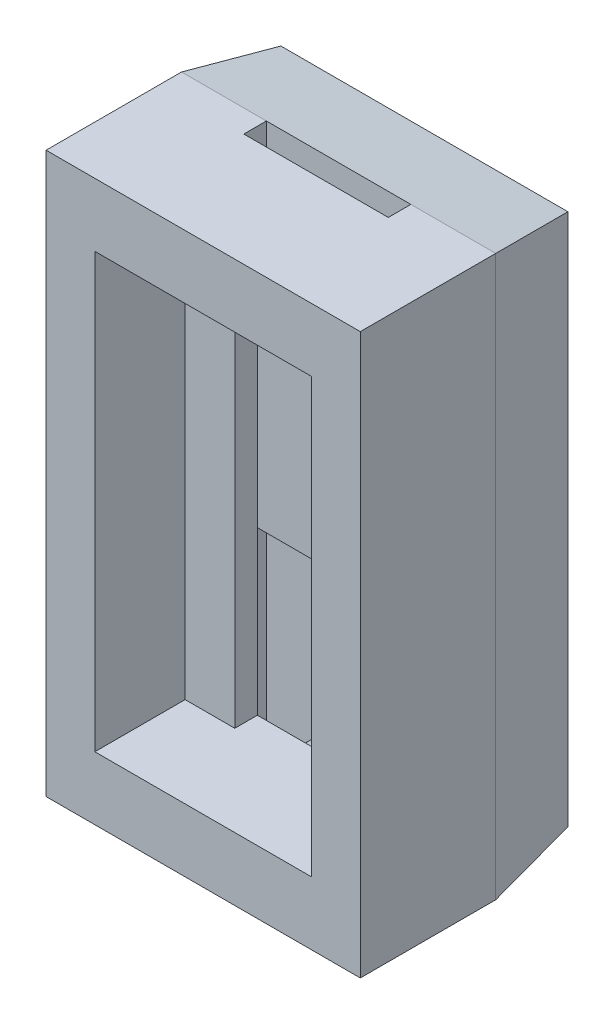
ISO-10303-21;
HEADER;
FILE_DESCRIPTION(('STEP AP214'),'2;1');
FILE_NAME('part.step','',(''),(''),'','','');
FILE_SCHEMA(('AUTOMOTIVE_DESIGN { 1 0 10303 214 1 1 1 1 }'));
ENDSEC;
DATA;
#1=APPLICATION_CONTEXT('core data for automotive mechanical design processes');
#2=APPLICATION_PROTOCOL_DEFINITION('international standard','automotive_design',2000,#1);
#3=PRODUCT_CONTEXT('',#1,'mechanical');
#4=PRODUCT('Part','Part','',(#3));
#5=PRODUCT_RELATED_PRODUCT_CATEGORY('part','',(#4));
#6=PRODUCT_DEFINITION_FORMATION('','',#4);
#7=PRODUCT_DEFINITION_CONTEXT('part definition',#1,'design');
#8=PRODUCT_DEFINITION('design','',#6,#7);
#9=PRODUCT_DEFINITION_SHAPE('','',#8);
#10=(LENGTH_UNIT() NAMED_UNIT(*) SI_UNIT(.MILLI.,.METRE.));
#11=(NAMED_UNIT(*) PLANE_ANGLE_UNIT() SI_UNIT($,.RADIAN.));
#12=(NAMED_UNIT(*) SI_UNIT($,.STERADIAN.) SOLID_ANGLE_UNIT());
#13=UNCERTAINTY_MEASURE_WITH_UNIT(LENGTH_MEASURE(1.E-05),#10,'distance_accuracy_value','');
#14=(GEOMETRIC_REPRESENTATION_CONTEXT(3) GLOBAL_UNCERTAINTY_ASSIGNED_CONTEXT((#13)) GLOBAL_UNIT_ASSIGNED_CONTEXT((#10,
#11,#12)) REPRESENTATION_CONTEXT('',''));
#15=CARTESIAN_POINT('',(0.,0.,0.));
#16=DIRECTION('',(0.,0.,1.));
#17=DIRECTION('',(1.,0.,0.));
#18=AXIS2_PLACEMENT_3D('',#15,#16,#17);
#19=CARTESIAN_POINT('',(0.8,-0.6,0.25));
#20=DIRECTION('',(1.,0.,0.));
#21=DIRECTION('',(0.,0.,-1.));
#22=AXIS2_PLACEMENT_3D('',#19,#20,#21);
#23=PLANE('',#22);
#24=DIRECTION('',(0.,0.,-1.));
#25=VECTOR('',#24,1.);
#26=CARTESIAN_POINT('',(0.8,-3.1,0.25));
#27=LINE('',#26,#25);
#28=CARTESIAN_POINT('',(0.8,-3.1,0.25));
#29=VERTEX_POINT('',#28);
#30=CARTESIAN_POINT('',(0.8,-3.1,0.));
#31=VERTEX_POINT('',#30);
#32=EDGE_CURVE('E230',#29,#31,#27,.T.);
#33=ORIENTED_EDGE('',*,*,#32,.F.);
#34=DIRECTION('',(0.,1.,0.));
#35=VECTOR('',#34,1.);
#36=CARTESIAN_POINT('',(0.8,-2.4,0.25));
#37=LINE('',#36,#35);
#38=CARTESIAN_POINT('',(0.8,-0.6,0.25));
#39=VERTEX_POINT('',#38);
#40=EDGE_CURVE('E341',#39,#29,#37,.F.);
#41=ORIENTED_EDGE('',*,*,#40,.F.);
#42=DIRECTION('',(0.,0.,-1.));
#43=VECTOR('',#42,1.);
#44=CARTESIAN_POINT('',(0.8,-0.6,0.25));
#45=LINE('',#44,#43);
#46=CARTESIAN_POINT('',(0.8,-0.6,0.));
#47=VERTEX_POINT('',#46);
#48=EDGE_CURVE('E239',#47,#39,#45,.F.);
#49=ORIENTED_EDGE('',*,*,#48,.F.);
#50=DIRECTION('',(0.,-1.,0.));
#51=VECTOR('',#50,1.);
#52=CARTESIAN_POINT('',(0.8,-0.6,0.));
#53=LINE('',#52,#51);
#54=EDGE_CURVE('E210',#31,#47,#53,.F.);
#55=ORIENTED_EDGE('',*,*,#54,.F.);
#56=EDGE_LOOP('',(#33,#41,#49,#55));
#57=FACE_BOUND('',#56,.T.);
#58=ADVANCED_FACE('F17',(#57),#23,.F.);
#59=CARTESIAN_POINT('',(-0.8,-3.1,0.25));
#60=DIRECTION('',(-1.,0.,0.));
#61=DIRECTION('',(0.,0.,1.));
#62=AXIS2_PLACEMENT_3D('',#59,#60,#61);
#63=PLANE('',#62);
#64=DIRECTION('',(0.,0.,-1.));
#65=VECTOR('',#64,1.);
#66=CARTESIAN_POINT('',(-0.8,-0.6,0.25));
#67=LINE('',#66,#65);
#68=CARTESIAN_POINT('',(-0.8,-0.6,0.25));
#69=VERTEX_POINT('',#68);
#70=CARTESIAN_POINT('',(-0.8,-0.6,0.));
#71=VERTEX_POINT('',#70);
#72=EDGE_CURVE('E252',#69,#71,#67,.T.);
#73=ORIENTED_EDGE('',*,*,#72,.F.);
#74=DIRECTION('',(0.,1.,0.));
#75=VECTOR('',#74,1.);
#76=CARTESIAN_POINT('',(-0.8,-2.4,0.25));
#77=LINE('',#76,#75);
#78=CARTESIAN_POINT('',(-0.8,-3.1,0.25));
#79=VERTEX_POINT('',#78);
#80=EDGE_CURVE('E343',#79,#69,#77,.T.);
#81=ORIENTED_EDGE('',*,*,#80,.F.);
#82=DIRECTION('',(0.,0.,1.));
#83=VECTOR('',#82,1.);
#84=CARTESIAN_POINT('',(-0.8,-3.1,0.25));
#85=LINE('',#84,#83);
#86=CARTESIAN_POINT('',(-0.8,-3.1,0.));
#87=VERTEX_POINT('',#86);
#88=EDGE_CURVE('E236',#87,#79,#85,.T.);
#89=ORIENTED_EDGE('',*,*,#88,.F.);
#90=DIRECTION('',(0.,-1.,0.));
#91=VECTOR('',#90,1.);
#92=CARTESIAN_POINT('',(-0.8,-0.6,0.));
#93=LINE('',#92,#91);
#94=EDGE_CURVE('E212',#71,#87,#93,.T.);
#95=ORIENTED_EDGE('',*,*,#94,.F.);
#96=EDGE_LOOP('',(#73,#81,#89,#95));
#97=FACE_BOUND('',#96,.T.);
#98=ADVANCED_FACE('F505',(#97),#63,.F.);
#99=CARTESIAN_POINT('',(-0.65,-0.6,0.));
#100=DIRECTION('',(0.,0.,1.));
#101=DIRECTION('',(0.,-1.,0.));
#102=AXIS2_PLACEMENT_3D('',#99,#100,#101);
#103=PLANE('',#102);
#104=ORIENTED_EDGE('',*,*,#54,.T.);
#105=DIRECTION('',(1.,0.,0.));
#106=VECTOR('',#105,1.);
#107=CARTESIAN_POINT('',(-0.65,-0.6,0.));
#108=LINE('',#107,#106);
#109=EDGE_CURVE('E253',#71,#47,#108,.T.);
#110=ORIENTED_EDGE('',*,*,#109,.F.);
#111=ORIENTED_EDGE('',*,*,#94,.T.);
#112=DIRECTION('',(1.,0.,0.));
#113=VECTOR('',#112,1.);
#114=CARTESIAN_POINT('',(-0.65,-3.1,0.));
#115=LINE('',#114,#113);
#116=EDGE_CURVE('E204',#87,#31,#115,.T.);
#117=ORIENTED_EDGE('',*,*,#116,.T.);
#118=EDGE_LOOP('',(#104,#110,#111,#117));
#119=FACE_BOUND('',#118,.T.);
#120=CARTESIAN_POINT('',(0.,-2.6,0.));
#121=DIRECTION('',(0.,0.,1.));
#122=DIRECTION('',(0.,-1.,0.));
#123=AXIS2_PLACEMENT_3D('',#120,#121,#122);
#124=CIRCLE('',#123,0.225);
#125=CARTESIAN_POINT('',(0.,-2.825,0.));
#126=VERTEX_POINT('',#125);
#127=EDGE_CURVE('E269',#126,#126,#124,.T.);
#128=ORIENTED_EDGE('',*,*,#127,.F.);
#129=EDGE_LOOP('',(#128));
#130=FACE_BOUND('',#129,.T.);
#131=ADVANCED_FACE('F206',(#119,#130),#103,.T.);
#132=CARTESIAN_POINT('',(0.65,0.,0.));
#133=DIRECTION('',(1.,0.,0.));
#134=DIRECTION('',(0.,0.,-1.));
#135=AXIS2_PLACEMENT_3D('',#132,#133,#134);
#136=PLANE('',#135);
#137=DIRECTION('',(0.,0.,-1.));
#138=VECTOR('',#137,1.);
#139=CARTESIAN_POINT('',(0.65,-2.4,0.));
#140=LINE('',#139,#138);
#141=CARTESIAN_POINT('',(0.65,-2.4,0.5));
#142=VERTEX_POINT('',#141);
#143=CARTESIAN_POINT('',(0.65,-2.4,0.25));
#144=VERTEX_POINT('',#143);
#145=EDGE_CURVE('E312',#142,#144,#140,.T.);
#146=ORIENTED_EDGE('',*,*,#145,.F.);
#147=DIRECTION('',(0.,1.,0.));
#148=VECTOR('',#147,1.);
#149=CARTESIAN_POINT('',(0.65,0.,0.5));
#150=LINE('',#149,#148);
#151=CARTESIAN_POINT('',(0.65,2.4,0.5));
#152=VERTEX_POINT('',#151);
#153=EDGE_CURVE('E297',#142,#152,#150,.T.);
#154=ORIENTED_EDGE('',*,*,#153,.T.);
#155=DIRECTION('',(0.,0.,-1.));
#156=VECTOR('',#155,1.);
#157=CARTESIAN_POINT('',(0.65,2.4,0.));
#158=LINE('',#157,#156);
#159=CARTESIAN_POINT('',(0.65,2.4,0.25));
#160=VERTEX_POINT('',#159);
#161=EDGE_CURVE('E243',#160,#152,#158,.F.);
#162=ORIENTED_EDGE('',*,*,#161,.F.);
#163=DIRECTION('',(0.,1.,0.));
#164=VECTOR('',#163,1.);
#165=CARTESIAN_POINT('',(0.65,0.,0.25));
#166=LINE('',#165,#164);
#167=CARTESIAN_POINT('',(0.65,1.4,0.25));
#168=VERTEX_POINT('',#167);
#169=EDGE_CURVE('E240',#168,#160,#166,.T.);
#170=ORIENTED_EDGE('',*,*,#169,.F.);
#171=DIRECTION('',(0.,1.,0.));
#172=VECTOR('',#171,1.);
#173=CARTESIAN_POINT('',(0.65,1.4,0.25));
#174=LINE('',#173,#172);
#175=CARTESIAN_POINT('',(0.65,-0.6,0.25));
#176=VERTEX_POINT('',#175);
#177=EDGE_CURVE('E268',#176,#168,#174,.T.);
#178=ORIENTED_EDGE('',*,*,#177,.F.);
#179=DIRECTION('',(0.,1.,0.));
#180=VECTOR('',#179,1.);
#181=CARTESIAN_POINT('',(0.65,-2.4,0.25));
#182=LINE('',#181,#180);
#183=EDGE_CURVE('E492',#144,#176,#182,.T.);
#184=ORIENTED_EDGE('',*,*,#183,.F.);
#185=EDGE_LOOP('',(#146,#154,#162,#170,#178,#184));
#186=FACE_BOUND('',#185,.T.);
#187=ADVANCED_FACE('F435',(#186),#136,.F.);
#188=CARTESIAN_POINT('',(-0.65,0.,0.));
#189=DIRECTION('',(1.,0.,0.));
#190=DIRECTION('',(0.,0.,-1.));
#191=AXIS2_PLACEMENT_3D('',#188,#189,#190);
#192=PLANE('',#191);
#193=DIRECTION('',(0.,0.,-1.));
#194=VECTOR('',#193,1.);
#195=CARTESIAN_POINT('',(-0.65,2.4,0.));
#196=LINE('',#195,#194);
#197=CARTESIAN_POINT('',(-0.65,2.4,0.25));
#198=VERTEX_POINT('',#197);
#199=CARTESIAN_POINT('',(-0.65,2.4,0.5));
#200=VERTEX_POINT('',#199);
#201=EDGE_CURVE('E258',#198,#200,#196,.F.);
#202=ORIENTED_EDGE('',*,*,#201,.T.);
#203=DIRECTION('',(0.,1.,0.));
#204=VECTOR('',#203,1.);
#205=CARTESIAN_POINT('',(-0.65,0.,0.5));
#206=LINE('',#205,#204);
#207=CARTESIAN_POINT('',(-0.65,-2.4,0.5));
#208=VERTEX_POINT('',#207);
#209=EDGE_CURVE('E265',#200,#208,#206,.F.);
#210=ORIENTED_EDGE('',*,*,#209,.T.);
#211=DIRECTION('',(0.,0.,-1.));
#212=VECTOR('',#211,1.);
#213=CARTESIAN_POINT('',(-0.65,-2.4,0.));
#214=LINE('',#213,#212);
#215=CARTESIAN_POINT('',(-0.65,-2.4,0.25));
#216=VERTEX_POINT('',#215);
#217=EDGE_CURVE('E259',#208,#216,#214,.T.);
#218=ORIENTED_EDGE('',*,*,#217,.T.);
#219=DIRECTION('',(0.,1.,0.));
#220=VECTOR('',#219,1.);
#221=CARTESIAN_POINT('',(-0.65,-2.4,0.25));
#222=LINE('',#221,#220);
#223=CARTESIAN_POINT('',(-0.65,-0.6,0.25));
#224=VERTEX_POINT('',#223);
#225=EDGE_CURVE('E463',#224,#216,#222,.F.);
#226=ORIENTED_EDGE('',*,*,#225,.F.);
#227=DIRECTION('',(0.,1.,0.));
#228=VECTOR('',#227,1.);
#229=CARTESIAN_POINT('',(-0.65,1.4,0.25));
#230=LINE('',#229,#228);
#231=CARTESIAN_POINT('',(-0.65,1.4,0.25));
#232=VERTEX_POINT('',#231);
#233=EDGE_CURVE('E323',#232,#224,#230,.F.);
#234=ORIENTED_EDGE('',*,*,#233,.F.);
#235=DIRECTION('',(0.,1.,0.));
#236=VECTOR('',#235,1.);
#237=CARTESIAN_POINT('',(-0.65,0.,0.25));
#238=LINE('',#237,#236);
#239=EDGE_CURVE('E256',#232,#198,#238,.T.);
#240=ORIENTED_EDGE('',*,*,#239,.T.);
#241=EDGE_LOOP('',(#202,#210,#218,#226,#234,#240));
#242=FACE_BOUND('',#241,.T.);
#243=ADVANCED_FACE('F461',(#242),#192,.T.);
#244=CARTESIAN_POINT('',(-0.65,-0.6,0.25));
#245=DIRECTION('',(0.,-1.,0.));
#246=DIRECTION('',(0.,0.,-1.));
#247=AXIS2_PLACEMENT_3D('',#244,#245,#246);
#248=PLANE('',#247);
#249=DIRECTION('',(-1.,0.,0.));
#250=VECTOR('',#249,1.);
#251=CARTESIAN_POINT('',(-0.65,-0.6,0.25));
#252=LINE('',#251,#250);
#253=EDGE_CURVE('E472',#69,#224,#252,.F.);
#254=ORIENTED_EDGE('',*,*,#253,.F.);
#255=ORIENTED_EDGE('',*,*,#72,.T.);
#256=ORIENTED_EDGE('',*,*,#109,.T.);
#257=ORIENTED_EDGE('',*,*,#48,.T.);
#258=DIRECTION('',(-1.,0.,0.));
#259=VECTOR('',#258,1.);
#260=CARTESIAN_POINT('',(-0.65,-0.6,0.25));
#261=LINE('',#260,#259);
#262=EDGE_CURVE('E344',#176,#39,#261,.F.);
#263=ORIENTED_EDGE('',*,*,#262,.F.);
#264=DIRECTION('',(1.,0.,0.));
#265=VECTOR('',#264,1.);
#266=CARTESIAN_POINT('',(-0.65,-0.6,0.25));
#267=LINE('',#266,#265);
#268=EDGE_CURVE('E443',#224,#176,#267,.T.);
#269=ORIENTED_EDGE('',*,*,#268,.F.);
#270=EDGE_LOOP('',(#254,#255,#256,#257,#263,#269));
#271=FACE_BOUND('',#270,.T.);
#272=ADVANCED_FACE('F500',(#271),#248,.T.);
#273=CARTESIAN_POINT('',(-0.65,-2.4,0.25));
#274=DIRECTION('',(0.,0.,-1.));
#275=DIRECTION('',(-1.,0.,0.));
#276=AXIS2_PLACEMENT_3D('',#273,#274,#275);
#277=PLANE('',#276);
#278=ORIENTED_EDGE('',*,*,#225,.T.);
#279=DIRECTION('',(-1.,0.,0.));
#280=VECTOR('',#279,1.);
#281=CARTESIAN_POINT('',(-0.65,-2.4,0.25));
#282=LINE('',#281,#280);
#283=CARTESIAN_POINT('',(-0.103077640640037,-2.39999999999993,0.25));
#284=VERTEX_POINT('',#283);
#285=EDGE_CURVE('E306',#216,#284,#282,.F.);
#286=ORIENTED_EDGE('',*,*,#285,.T.);
#287=CARTESIAN_POINT('',(0.,-2.6,0.25));
#288=DIRECTION('',(0.,0.,1.));
#289=DIRECTION('',(0.,-1.,0.));
#290=AXIS2_PLACEMENT_3D('',#287,#288,#289);
#291=CIRCLE('',#290,0.225);
#292=CARTESIAN_POINT('',(0.103077640640053,-2.3999999999999,0.25));
#293=VERTEX_POINT('',#292);
#294=EDGE_CURVE('E300',#293,#284,#291,.F.);
#295=ORIENTED_EDGE('',*,*,#294,.F.);
#296=DIRECTION('',(-1.,0.,0.));
#297=VECTOR('',#296,1.);
#298=CARTESIAN_POINT('',(-0.65,-2.4,0.25));
#299=LINE('',#298,#297);
#300=EDGE_CURVE('E381',#293,#144,#299,.F.);
#301=ORIENTED_EDGE('',*,*,#300,.T.);
#302=ORIENTED_EDGE('',*,*,#183,.T.);
#303=ORIENTED_EDGE('',*,*,#262,.T.);
#304=ORIENTED_EDGE('',*,*,#40,.T.);
#305=DIRECTION('',(1.,0.,0.));
#306=VECTOR('',#305,1.);
#307=CARTESIAN_POINT('',(-1.74,-3.1,0.25));
#308=LINE('',#307,#306);
#309=EDGE_CURVE('E225',#29,#79,#308,.F.);
#310=ORIENTED_EDGE('',*,*,#309,.T.);
#311=ORIENTED_EDGE('',*,*,#80,.T.);
#312=ORIENTED_EDGE('',*,*,#253,.T.);
#313=EDGE_LOOP('',(#278,#286,#295,#301,#302,#303,#304,#310,#311,#312));
#314=FACE_BOUND('',#313,.T.);
#315=ADVANCED_FACE('F837',(#314),#277,.T.);
#316=CARTESIAN_POINT('',(0.,0.,0.5));
#317=DIRECTION('',(0.,0.,-1.));
#318=DIRECTION('',(-1.,0.,0.));
#319=AXIS2_PLACEMENT_3D('',#316,#317,#318);
#320=PLANE('',#319);
#321=ORIENTED_EDGE('',*,*,#153,.F.);
#322=DIRECTION('',(-1.,0.,0.));
#323=VECTOR('',#322,1.);
#324=CARTESIAN_POINT('',(0.,-2.4,0.5));
#325=LINE('',#324,#323);
#326=CARTESIAN_POINT('',(1.2,-2.4,0.5));
#327=VERTEX_POINT('',#326);
#328=EDGE_CURVE('E301',#327,#142,#325,.T.);
#329=ORIENTED_EDGE('',*,*,#328,.F.);
#330=DIRECTION('',(0.,1.,0.));
#331=VECTOR('',#330,1.);
#332=CARTESIAN_POINT('',(1.2,2.4,0.5));
#333=LINE('',#332,#331);
#334=CARTESIAN_POINT('',(1.2,2.4,0.5));
#335=VERTEX_POINT('',#334);
#336=EDGE_CURVE('E603',#335,#327,#333,.F.);
#337=ORIENTED_EDGE('',*,*,#336,.F.);
#338=DIRECTION('',(1.,0.,0.));
#339=VECTOR('',#338,1.);
#340=CARTESIAN_POINT('',(-1.2,2.4,0.5));
#341=LINE('',#340,#339);
#342=EDGE_CURVE('E315',#152,#335,#341,.T.);
#343=ORIENTED_EDGE('',*,*,#342,.F.);
#344=EDGE_LOOP('',(#321,#329,#337,#343));
#345=FACE_BOUND('',#344,.T.);
#346=ADVANCED_FACE('F829',(#345),#320,.F.);
#347=CARTESIAN_POINT('',(0.,-2.6,0.25));
#348=DIRECTION('',(0.,0.,1.));
#349=DIRECTION('',(0.,-1.,0.));
#350=AXIS2_PLACEMENT_3D('',#347,#348,#349);
#351=CYLINDRICAL_SURFACE('',#350,0.225);
#352=ORIENTED_EDGE('',*,*,#127,.T.);
#353=EDGE_LOOP('',(#352));
#354=FACE_BOUND('',#353,.T.);
#355=CARTESIAN_POINT('',(0.10307764064,-2.4,0.25));
#356=DIRECTION('',(-1.,0.,0.));
#357=VECTOR('',#356,1.);
#358=LINE('',#355,#357);
#359=EDGE_CURVE('E294',#293,#284,#358,.T.);
#360=ORIENTED_EDGE('',*,*,#359,.F.);
#361=ORIENTED_EDGE('',*,*,#294,.T.);
#362=EDGE_LOOP('',(#360,#361));
#363=FACE_BOUND('',#362,.T.);
#364=ADVANCED_FACE('F373',(#354,#363),#351,.T.);
#365=CARTESIAN_POINT('',(0.,0.,0.5));
#366=DIRECTION('',(0.,0.,-1.));
#367=DIRECTION('',(-1.,0.,0.));
#368=AXIS2_PLACEMENT_3D('',#365,#366,#367);
#369=PLANE('',#368);
#370=DIRECTION('',(1.,0.,0.));
#371=VECTOR('',#370,1.);
#372=CARTESIAN_POINT('',(-1.2,2.4,0.5));
#373=LINE('',#372,#371);
#374=CARTESIAN_POINT('',(-1.2,2.4,0.5));
#375=VERTEX_POINT('',#374);
#376=EDGE_CURVE('E272',#375,#200,#373,.T.);
#377=ORIENTED_EDGE('',*,*,#376,.F.);
#378=DIRECTION('',(0.,1.,0.));
#379=VECTOR('',#378,1.);
#380=CARTESIAN_POINT('',(-1.2,-2.4,0.5));
#381=LINE('',#380,#379);
#382=CARTESIAN_POINT('',(-1.2,-2.4,0.5));
#383=VERTEX_POINT('',#382);
#384=EDGE_CURVE('E597',#383,#375,#381,.T.);
#385=ORIENTED_EDGE('',*,*,#384,.F.);
#386=DIRECTION('',(-1.,0.,0.));
#387=VECTOR('',#386,1.);
#388=CARTESIAN_POINT('',(1.2,-2.4,0.5));
#389=LINE('',#388,#387);
#390=EDGE_CURVE('E291',#208,#383,#389,.T.);
#391=ORIENTED_EDGE('',*,*,#390,.F.);
#392=ORIENTED_EDGE('',*,*,#209,.F.);
#393=EDGE_LOOP('',(#377,#385,#391,#392));
#394=FACE_BOUND('',#393,.T.);
#395=ADVANCED_FACE('F815',(#394),#369,.F.);
#396=CARTESIAN_POINT('',(-0.65,1.4,0.25));
#397=DIRECTION('',(0.,0.,1.));
#398=DIRECTION('',(1.,0.,0.));
#399=AXIS2_PLACEMENT_3D('',#396,#397,#398);
#400=PLANE('',#399);
#401=ORIENTED_EDGE('',*,*,#233,.T.);
#402=ORIENTED_EDGE('',*,*,#268,.T.);
#403=ORIENTED_EDGE('',*,*,#177,.T.);
#404=DIRECTION('',(1.,0.,0.));
#405=VECTOR('',#404,1.);
#406=CARTESIAN_POINT('',(-0.65,1.4,0.25));
#407=LINE('',#406,#405);
#408=EDGE_CURVE('E285',#232,#168,#407,.T.);
#409=ORIENTED_EDGE('',*,*,#408,.F.);
#410=EDGE_LOOP('',(#401,#402,#403,#409));
#411=FACE_BOUND('',#410,.T.);
#412=ADVANCED_FACE('F441',(#411),#400,.T.);
#413=CARTESIAN_POINT('',(-0.65,3.1,0.25));
#414=DIRECTION('',(0.,0.,-1.));
#415=DIRECTION('',(-1.,0.,0.));
#416=AXIS2_PLACEMENT_3D('',#413,#414,#415);
#417=PLANE('',#416);
#418=ORIENTED_EDGE('',*,*,#169,.T.);
#419=DIRECTION('',(1.,0.,0.));
#420=VECTOR('',#419,1.);
#421=CARTESIAN_POINT('',(-1.2,2.4,0.25));
#422=LINE('',#421,#420);
#423=CARTESIAN_POINT('',(0.103077640640053,2.3999999999999,0.25));
#424=VERTEX_POINT('',#423);
#425=EDGE_CURVE('E318',#424,#160,#422,.T.);
#426=ORIENTED_EDGE('',*,*,#425,.F.);
#427=CARTESIAN_POINT('',(0.,2.6,0.25));
#428=DIRECTION('',(0.,0.,1.));
#429=DIRECTION('',(0.,-1.,0.));
#430=AXIS2_PLACEMENT_3D('',#427,#428,#429);
#431=CIRCLE('',#430,0.225);
#432=CARTESIAN_POINT('',(-0.103077640640037,2.39999999999993,0.25));
#433=VERTEX_POINT('',#432);
#434=EDGE_CURVE('E288',#433,#424,#431,.F.);
#435=ORIENTED_EDGE('',*,*,#434,.F.);
#436=DIRECTION('',(1.,0.,0.));
#437=VECTOR('',#436,1.);
#438=CARTESIAN_POINT('',(-1.2,2.4,0.25));
#439=LINE('',#438,#437);
#440=EDGE_CURVE('E275',#198,#433,#439,.T.);
#441=ORIENTED_EDGE('',*,*,#440,.F.);
#442=ORIENTED_EDGE('',*,*,#239,.F.);
#443=DIRECTION('',(1.,0.,0.));
#444=VECTOR('',#443,1.);
#445=CARTESIAN_POINT('',(-0.65,1.4,0.25));
#446=LINE('',#445,#444);
#447=CARTESIAN_POINT('',(-0.8,1.4,0.25));
#448=VERTEX_POINT('',#447);
#449=EDGE_CURVE('E278',#448,#232,#446,.T.);
#450=ORIENTED_EDGE('',*,*,#449,.F.);
#451=DIRECTION('',(0.,1.,0.));
#452=VECTOR('',#451,1.);
#453=CARTESIAN_POINT('',(-0.8,3.1,0.25));
#454=LINE('',#453,#452);
#455=CARTESIAN_POINT('',(-0.8,3.1,0.25));
#456=VERTEX_POINT('',#455);
#457=EDGE_CURVE('E455',#456,#448,#454,.F.);
#458=ORIENTED_EDGE('',*,*,#457,.F.);
#459=DIRECTION('',(1.,0.,0.));
#460=VECTOR('',#459,1.);
#461=CARTESIAN_POINT('',(1.74,3.1,0.25));
#462=LINE('',#461,#460);
#463=CARTESIAN_POINT('',(0.8,3.1,0.25));
#464=VERTEX_POINT('',#463);
#465=EDGE_CURVE('E338',#456,#464,#462,.T.);
#466=ORIENTED_EDGE('',*,*,#465,.T.);
#467=DIRECTION('',(0.,1.,0.));
#468=VECTOR('',#467,1.);
#469=CARTESIAN_POINT('',(0.8,1.4,0.25));
#470=LINE('',#469,#468);
#471=CARTESIAN_POINT('',(0.8,1.4,0.25));
#472=VERTEX_POINT('',#471);
#473=EDGE_CURVE('E592',#472,#464,#470,.T.);
#474=ORIENTED_EDGE('',*,*,#473,.F.);
#475=DIRECTION('',(1.,0.,0.));
#476=VECTOR('',#475,1.);
#477=CARTESIAN_POINT('',(-0.65,1.4,0.25));
#478=LINE('',#477,#476);
#479=EDGE_CURVE('E282',#168,#472,#478,.T.);
#480=ORIENTED_EDGE('',*,*,#479,.F.);
#481=EDGE_LOOP('',(#418,#426,#435,#441,#442,#450,#458,#466,#474,#480));
#482=FACE_BOUND('',#481,.T.);
#483=ADVANCED_FACE('F431',(#482),#417,.T.);
#484=CARTESIAN_POINT('',(1.74,3.1,1.5));
#485=DIRECTION('',(0.,-1.,0.));
#486=DIRECTION('',(0.,0.,-1.));
#487=AXIS2_PLACEMENT_3D('',#484,#485,#486);
#488=PLANE('',#487);
#489=ORIENTED_EDGE('',*,*,#465,.F.);
#490=DIRECTION('',(0.,0.,-1.));
#491=VECTOR('',#490,1.);
#492=CARTESIAN_POINT('',(-0.8,3.1,0.25));
#493=LINE('',#492,#491);
#494=CARTESIAN_POINT('',(-0.8,3.1,0.));
#495=VERTEX_POINT('',#494);
#496=EDGE_CURVE('E586',#495,#456,#493,.F.);
#497=ORIENTED_EDGE('',*,*,#496,.F.);
#498=DIRECTION('',(1.,0.,0.));
#499=VECTOR('',#498,1.);
#500=CARTESIAN_POINT('',(1.74,3.1,0.));
#501=LINE('',#500,#499);
#502=CARTESIAN_POINT('',(-1.74,3.1,0.));
#503=VERTEX_POINT('',#502);
#504=EDGE_CURVE('E612',#503,#495,#501,.T.);
#505=ORIENTED_EDGE('',*,*,#504,.F.);
#506=DIRECTION('',(0.,0.,-1.));
#507=VECTOR('',#506,1.);
#508=CARTESIAN_POINT('',(-1.74,3.1,1.5));
#509=LINE('',#508,#507);
#510=CARTESIAN_POINT('',(-1.74,3.1,1.5));
#511=VERTEX_POINT('',#510);
#512=EDGE_CURVE('E614',#511,#503,#509,.T.);
#513=ORIENTED_EDGE('',*,*,#512,.F.);
#514=DIRECTION('',(1.,0.,0.));
#515=VECTOR('',#514,1.);
#516=CARTESIAN_POINT('',(0.,3.1,1.5));
#517=LINE('',#516,#515);
#518=CARTESIAN_POINT('',(1.74,3.1,1.5));
#519=VERTEX_POINT('',#518);
#520=EDGE_CURVE('E581',#519,#511,#517,.F.);
#521=ORIENTED_EDGE('',*,*,#520,.F.);
#522=DIRECTION('',(0.,0.,-1.));
#523=VECTOR('',#522,1.);
#524=CARTESIAN_POINT('',(1.74,3.1,1.5));
#525=LINE('',#524,#523);
#526=CARTESIAN_POINT('',(1.74,3.1,0.));
#527=VERTEX_POINT('',#526);
#528=EDGE_CURVE('E617',#527,#519,#525,.F.);
#529=ORIENTED_EDGE('',*,*,#528,.F.);
#530=DIRECTION('',(1.,0.,0.));
#531=VECTOR('',#530,1.);
#532=CARTESIAN_POINT('',(1.74,3.1,0.));
#533=LINE('',#532,#531);
#534=CARTESIAN_POINT('',(0.8,3.1,0.));
#535=VERTEX_POINT('',#534);
#536=EDGE_CURVE('E465',#535,#527,#533,.T.);
#537=ORIENTED_EDGE('',*,*,#536,.F.);
#538=DIRECTION('',(0.,0.,1.));
#539=VECTOR('',#538,1.);
#540=CARTESIAN_POINT('',(0.8,3.1,0.25));
#541=LINE('',#540,#539);
#542=EDGE_CURVE('E589',#464,#535,#541,.F.);
#543=ORIENTED_EDGE('',*,*,#542,.F.);
#544=EDGE_LOOP('',(#489,#497,#505,#513,#521,#529,#537,#543));
#545=FACE_BOUND('',#544,.T.);
#546=ADVANCED_FACE('F797',(#545),#488,.F.);
#547=CARTESIAN_POINT('',(-1.74,-3.1,1.5));
#548=DIRECTION('',(0.,1.,0.));
#549=DIRECTION('',(0.,0.,1.));
#550=AXIS2_PLACEMENT_3D('',#547,#548,#549);
#551=PLANE('',#550);
#552=ORIENTED_EDGE('',*,*,#32,.T.);
#553=DIRECTION('',(1.,0.,0.));
#554=VECTOR('',#553,1.);
#555=CARTESIAN_POINT('',(-1.74,-3.1,0.));
#556=LINE('',#555,#554);
#557=CARTESIAN_POINT('',(1.74,-3.1,0.));
#558=VERTEX_POINT('',#557);
#559=EDGE_CURVE('E218',#558,#31,#556,.F.);
#560=ORIENTED_EDGE('',*,*,#559,.F.);
#561=DIRECTION('',(0.,0.,1.));
#562=VECTOR('',#561,1.);
#563=CARTESIAN_POINT('',(1.74,-3.1,1.5));
#564=LINE('',#563,#562);
#565=CARTESIAN_POINT('',(1.74,-3.1,1.5));
#566=VERTEX_POINT('',#565);
#567=EDGE_CURVE('E226',#566,#558,#564,.F.);
#568=ORIENTED_EDGE('',*,*,#567,.F.);
#569=DIRECTION('',(1.,0.,0.));
#570=VECTOR('',#569,1.);
#571=CARTESIAN_POINT('',(0.,-3.1,1.5));
#572=LINE('',#571,#570);
#573=CARTESIAN_POINT('',(-1.74,-3.1,1.5));
#574=VERTEX_POINT('',#573);
#575=EDGE_CURVE('E578',#574,#566,#572,.T.);
#576=ORIENTED_EDGE('',*,*,#575,.F.);
#577=DIRECTION('',(0.,0.,1.));
#578=VECTOR('',#577,1.);
#579=CARTESIAN_POINT('',(-1.74,-3.1,1.5));
#580=LINE('',#579,#578);
#581=CARTESIAN_POINT('',(-1.74,-3.1,0.));
#582=VERTEX_POINT('',#581);
#583=EDGE_CURVE('E337',#582,#574,#580,.T.);
#584=ORIENTED_EDGE('',*,*,#583,.F.);
#585=DIRECTION('',(1.,0.,0.));
#586=VECTOR('',#585,1.);
#587=CARTESIAN_POINT('',(-1.74,-3.1,0.));
#588=LINE('',#587,#586);
#589=EDGE_CURVE('E335',#87,#582,#588,.F.);
#590=ORIENTED_EDGE('',*,*,#589,.F.);
#591=ORIENTED_EDGE('',*,*,#88,.T.);
#592=ORIENTED_EDGE('',*,*,#309,.F.);
#593=EDGE_LOOP('',(#552,#560,#568,#576,#584,#590,#591,#592));
#594=FACE_BOUND('',#593,.T.);
#595=ADVANCED_FACE('F231',(#594),#551,.F.);
#596=CARTESIAN_POINT('',(-1.2,2.4,0.5));
#597=DIRECTION('',(0.,-1.,0.));
#598=DIRECTION('',(1.,0.,0.));
#599=AXIS2_PLACEMENT_3D('',#596,#597,#598);
#600=PLANE('',#599);
#601=ORIENTED_EDGE('',*,*,#342,.T.);
#602=DIRECTION('',(0.,0.,1.));
#603=VECTOR('',#602,1.);
#604=CARTESIAN_POINT('',(1.2,2.4,0.5));
#605=LINE('',#604,#603);
#606=CARTESIAN_POINT('',(1.2,2.4,1.5));
#607=VERTEX_POINT('',#606);
#608=EDGE_CURVE('E317',#607,#335,#605,.F.);
#609=ORIENTED_EDGE('',*,*,#608,.F.);
#610=DIRECTION('',(1.,0.,0.));
#611=VECTOR('',#610,1.);
#612=CARTESIAN_POINT('',(0.,2.4,1.5));
#613=LINE('',#612,#611);
#614=CARTESIAN_POINT('',(-1.2,2.4,1.5));
#615=VERTEX_POINT('',#614);
#616=EDGE_CURVE('E576',#615,#607,#613,.T.);
#617=ORIENTED_EDGE('',*,*,#616,.F.);
#618=DIRECTION('',(0.,0.,-1.));
#619=VECTOR('',#618,1.);
#620=CARTESIAN_POINT('',(-1.2,2.4,0.5));
#621=LINE('',#620,#619);
#622=EDGE_CURVE('E595',#375,#615,#621,.F.);
#623=ORIENTED_EDGE('',*,*,#622,.F.);
#624=ORIENTED_EDGE('',*,*,#376,.T.);
#625=ORIENTED_EDGE('',*,*,#201,.F.);
#626=ORIENTED_EDGE('',*,*,#440,.T.);
#627=CARTESIAN_POINT('',(0.,2.6,0.25));
#628=DIRECTION('',(0.,0.,-1.));
#629=DIRECTION('',(0.458122847289306,-0.888888888889685,0.));
#630=AXIS2_PLACEMENT_3D('',#627,#628,#629);
#631=CIRCLE('',#630,0.225);
#632=EDGE_CURVE('E364',#424,#433,#631,.T.);
#633=ORIENTED_EDGE('',*,*,#632,.F.);
#634=ORIENTED_EDGE('',*,*,#425,.T.);
#635=ORIENTED_EDGE('',*,*,#161,.T.);
#636=EDGE_LOOP('',(#601,#609,#617,#623,#624,#625,#626,#633,#634,#635));
#637=FACE_BOUND('',#636,.T.);
#638=ADVANCED_FACE('F405',(#637),#600,.T.);
#639=CARTESIAN_POINT('',(1.2,2.4,0.5));
#640=DIRECTION('',(-1.,0.,0.));
#641=DIRECTION('',(0.,0.,1.));
#642=AXIS2_PLACEMENT_3D('',#639,#640,#641);
#643=PLANE('',#642);
#644=ORIENTED_EDGE('',*,*,#336,.T.);
#645=DIRECTION('',(0.,0.,1.));
#646=VECTOR('',#645,1.);
#647=CARTESIAN_POINT('',(1.2,-2.4,0.5));
#648=LINE('',#647,#646);
#649=CARTESIAN_POINT('',(1.2,-2.4,1.5));
#650=VERTEX_POINT('',#649);
#651=EDGE_CURVE('E382',#650,#327,#648,.F.);
#652=ORIENTED_EDGE('',*,*,#651,.F.);
#653=DIRECTION('',(0.,1.,0.));
#654=VECTOR('',#653,1.);
#655=CARTESIAN_POINT('',(1.2,0.,1.5));
#656=LINE('',#655,#654);
#657=EDGE_CURVE('E574',#607,#650,#656,.F.);
#658=ORIENTED_EDGE('',*,*,#657,.F.);
#659=ORIENTED_EDGE('',*,*,#608,.T.);
#660=EDGE_LOOP('',(#644,#652,#658,#659));
#661=FACE_BOUND('',#660,.T.);
#662=ADVANCED_FACE('F401',(#661),#643,.T.);
#663=CARTESIAN_POINT('',(1.2,-2.4,0.5));
#664=DIRECTION('',(0.,1.,0.));
#665=DIRECTION('',(-1.,0.,0.));
#666=AXIS2_PLACEMENT_3D('',#663,#664,#665);
#667=PLANE('',#666);
#668=ORIENTED_EDGE('',*,*,#390,.T.);
#669=DIRECTION('',(0.,0.,-1.));
#670=VECTOR('',#669,1.);
#671=CARTESIAN_POINT('',(-1.2,-2.4,0.5));
#672=LINE('',#671,#670);
#673=CARTESIAN_POINT('',(-1.2,-2.4,1.5));
#674=VERTEX_POINT('',#673);
#675=EDGE_CURVE('E293',#674,#383,#672,.T.);
#676=ORIENTED_EDGE('',*,*,#675,.F.);
#677=DIRECTION('',(1.,0.,0.));
#678=VECTOR('',#677,1.);
#679=CARTESIAN_POINT('',(0.,-2.4,1.5));
#680=LINE('',#679,#678);
#681=EDGE_CURVE('E572',#650,#674,#680,.F.);
#682=ORIENTED_EDGE('',*,*,#681,.F.);
#683=ORIENTED_EDGE('',*,*,#651,.T.);
#684=ORIENTED_EDGE('',*,*,#328,.T.);
#685=ORIENTED_EDGE('',*,*,#145,.T.);
#686=ORIENTED_EDGE('',*,*,#300,.F.);
#687=ORIENTED_EDGE('',*,*,#359,.T.);
#688=ORIENTED_EDGE('',*,*,#285,.F.);
#689=ORIENTED_EDGE('',*,*,#217,.F.);
#690=EDGE_LOOP('',(#668,#676,#682,#683,#684,#685,#686,#687,#688,#689));
#691=FACE_BOUND('',#690,.T.);
#692=ADVANCED_FACE('F379',(#691),#667,.T.);
#693=CARTESIAN_POINT('',(-1.2,-2.4,0.5));
#694=DIRECTION('',(1.,0.,0.));
#695=DIRECTION('',(0.,0.,-1.));
#696=AXIS2_PLACEMENT_3D('',#693,#694,#695);
#697=PLANE('',#696);
#698=ORIENTED_EDGE('',*,*,#384,.T.);
#699=ORIENTED_EDGE('',*,*,#622,.T.);
#700=DIRECTION('',(0.,1.,0.));
#701=VECTOR('',#700,1.);
#702=CARTESIAN_POINT('',(-1.2,0.,1.5));
#703=LINE('',#702,#701);
#704=EDGE_CURVE('E569',#674,#615,#703,.T.);
#705=ORIENTED_EDGE('',*,*,#704,.F.);
#706=ORIENTED_EDGE('',*,*,#675,.T.);
#707=EDGE_LOOP('',(#698,#699,#705,#706));
#708=FACE_BOUND('',#707,.T.);
#709=ADVANCED_FACE('F400',(#708),#697,.T.);
#710=CARTESIAN_POINT('',(0.,2.6,0.25));
#711=DIRECTION('',(0.,0.,1.));
#712=DIRECTION('',(0.,-1.,0.));
#713=AXIS2_PLACEMENT_3D('',#710,#711,#712);
#714=CYLINDRICAL_SURFACE('',#713,0.225);
#715=CARTESIAN_POINT('',(0.,2.6,0.));
#716=DIRECTION('',(0.,0.,1.));
#717=DIRECTION('',(0.,-1.,0.));
#718=AXIS2_PLACEMENT_3D('',#715,#716,#717);
#719=CIRCLE('',#718,0.225);
#720=CARTESIAN_POINT('',(0.,2.375,0.));
#721=VERTEX_POINT('',#720);
#722=EDGE_CURVE('E357',#721,#721,#719,.F.);
#723=ORIENTED_EDGE('',*,*,#722,.F.);
#724=EDGE_LOOP('',(#723));
#725=FACE_BOUND('',#724,.T.);
#726=ORIENTED_EDGE('',*,*,#434,.T.);
#727=ORIENTED_EDGE('',*,*,#632,.T.);
#728=EDGE_LOOP('',(#726,#727));
#729=FACE_BOUND('',#728,.T.);
#730=ADVANCED_FACE('F624',(#725,#729),#714,.T.);
#731=CARTESIAN_POINT('',(-0.65,1.4,0.));
#732=DIRECTION('',(0.,1.,0.));
#733=DIRECTION('',(0.,0.,1.));
#734=AXIS2_PLACEMENT_3D('',#731,#732,#733);
#735=PLANE('',#734);
#736=DIRECTION('',(0.,0.,-1.));
#737=VECTOR('',#736,1.);
#738=CARTESIAN_POINT('',(-0.8,1.4,0.25));
#739=LINE('',#738,#737);
#740=CARTESIAN_POINT('',(-0.8,1.4,0.));
#741=VERTEX_POINT('',#740);
#742=EDGE_CURVE('E452',#448,#741,#739,.T.);
#743=ORIENTED_EDGE('',*,*,#742,.F.);
#744=ORIENTED_EDGE('',*,*,#449,.T.);
#745=ORIENTED_EDGE('',*,*,#408,.T.);
#746=ORIENTED_EDGE('',*,*,#479,.T.);
#747=DIRECTION('',(0.,0.,1.));
#748=VECTOR('',#747,1.);
#749=CARTESIAN_POINT('',(0.8,1.4,0.25));
#750=LINE('',#749,#748);
#751=CARTESIAN_POINT('',(0.8,1.4,0.));
#752=VERTEX_POINT('',#751);
#753=EDGE_CURVE('E281',#752,#472,#750,.T.);
#754=ORIENTED_EDGE('',*,*,#753,.F.);
#755=DIRECTION('',(1.,0.,0.));
#756=VECTOR('',#755,1.);
#757=CARTESIAN_POINT('',(-0.65,1.4,0.));
#758=LINE('',#757,#756);
#759=EDGE_CURVE('E360',#741,#752,#758,.T.);
#760=ORIENTED_EDGE('',*,*,#759,.F.);
#761=EDGE_LOOP('',(#743,#744,#745,#746,#754,#760));
#762=FACE_BOUND('',#761,.T.);
#763=ADVANCED_FACE('F447',(#762),#735,.T.);
#764=CARTESIAN_POINT('',(0.8,1.4,0.25));
#765=DIRECTION('',(-1.,0.,0.));
#766=DIRECTION('',(0.,0.,1.));
#767=AXIS2_PLACEMENT_3D('',#764,#765,#766);
#768=PLANE('',#767);
#769=ORIENTED_EDGE('',*,*,#473,.T.);
#770=ORIENTED_EDGE('',*,*,#542,.T.);
#771=DIRECTION('',(0.,-1.,0.));
#772=VECTOR('',#771,1.);
#773=CARTESIAN_POINT('',(0.8,3.1,0.));
#774=LINE('',#773,#772);
#775=EDGE_CURVE('E563',#752,#535,#774,.F.);
#776=ORIENTED_EDGE('',*,*,#775,.F.);
#777=ORIENTED_EDGE('',*,*,#753,.T.);
#778=EDGE_LOOP('',(#769,#770,#776,#777));
#779=FACE_BOUND('',#778,.T.);
#780=ADVANCED_FACE('F636',(#779),#768,.T.);
#781=CARTESIAN_POINT('',(-0.8,3.1,0.25));
#782=DIRECTION('',(1.,0.,0.));
#783=DIRECTION('',(0.,0.,-1.));
#784=AXIS2_PLACEMENT_3D('',#781,#782,#783);
#785=PLANE('',#784);
#786=ORIENTED_EDGE('',*,*,#457,.T.);
#787=ORIENTED_EDGE('',*,*,#742,.T.);
#788=DIRECTION('',(0.,-1.,0.));
#789=VECTOR('',#788,1.);
#790=CARTESIAN_POINT('',(-0.8,3.1,0.));
#791=LINE('',#790,#789);
#792=EDGE_CURVE('E560',#495,#741,#791,.T.);
#793=ORIENTED_EDGE('',*,*,#792,.F.);
#794=ORIENTED_EDGE('',*,*,#496,.T.);
#795=EDGE_LOOP('',(#786,#787,#793,#794));
#796=FACE_BOUND('',#795,.T.);
#797=ADVANCED_FACE('F639',(#796),#785,.T.);
#798=CARTESIAN_POINT('',(0.,0.,1.5));
#799=DIRECTION('',(0.,0.,1.));
#800=DIRECTION('',(1.,0.,0.));
#801=AXIS2_PLACEMENT_3D('',#798,#799,#800);
#802=PLANE('',#801);
#803=ORIENTED_EDGE('',*,*,#681,.T.);
#804=ORIENTED_EDGE('',*,*,#704,.T.);
#805=ORIENTED_EDGE('',*,*,#616,.T.);
#806=ORIENTED_EDGE('',*,*,#657,.T.);
#807=EDGE_LOOP('',(#803,#804,#805,#806));
#808=FACE_BOUND('',#807,.T.);
#809=ORIENTED_EDGE('',*,*,#575,.T.);
#810=DIRECTION('',(0.,1.,0.));
#811=VECTOR('',#810,1.);
#812=CARTESIAN_POINT('',(1.74,-3.1,1.5));
#813=LINE('',#812,#811);
#814=EDGE_CURVE('E361',#566,#519,#813,.T.);
#815=ORIENTED_EDGE('',*,*,#814,.T.);
#816=ORIENTED_EDGE('',*,*,#520,.T.);
#817=DIRECTION('',(0.,1.,0.));
#818=VECTOR('',#817,1.);
#819=CARTESIAN_POINT('',(-1.74,3.1,1.5));
#820=LINE('',#819,#818);
#821=EDGE_CURVE('E557',#511,#574,#820,.F.);
#822=ORIENTED_EDGE('',*,*,#821,.T.);
#823=EDGE_LOOP('',(#809,#815,#816,#822));
#824=FACE_BOUND('',#823,.T.);
#825=ADVANCED_FACE('F643',(#808,#824),#802,.T.);
#826=CARTESIAN_POINT('',(0.,0.,-0.65));
#827=DIRECTION('',(0.,0.,1.));
#828=DIRECTION('',(1.,0.,0.));
#829=AXIS2_PLACEMENT_3D('',#826,#827,#828);
#830=PLANE('',#829);
#831=CARTESIAN_POINT('',(0.,0.,-0.65));
#832=DIRECTION('',(0.,0.,1.));
#833=DIRECTION('',(1.,0.,0.));
#834=AXIS2_PLACEMENT_3D('',#831,#832,#833);
#835=CIRCLE('',#834,0.95);
#836=CARTESIAN_POINT('',(0.95,0.,-0.65));
#837=VERTEX_POINT('',#836);
#838=EDGE_CURVE('E352',#837,#837,#835,.F.);
#839=ORIENTED_EDGE('',*,*,#838,.T.);
#840=EDGE_LOOP('',(#839));
#841=FACE_BOUND('',#840,.T.);
#842=ADVANCED_FACE('F647',(#841),#830,.F.);
#843=CARTESIAN_POINT('',(1.74,-3.1,1.5));
#844=DIRECTION('',(-1.,0.,0.));
#845=DIRECTION('',(0.,0.,1.));
#846=AXIS2_PLACEMENT_3D('',#843,#844,#845);
#847=PLANE('',#846);
#848=ORIENTED_EDGE('',*,*,#528,.T.);
#849=ORIENTED_EDGE('',*,*,#814,.F.);
#850=ORIENTED_EDGE('',*,*,#567,.T.);
#851=DIRECTION('',(0.,1.,0.));
#852=VECTOR('',#851,1.);
#853=CARTESIAN_POINT('',(1.74,0.,0.));
#854=LINE('',#853,#852);
#855=EDGE_CURVE('E515',#527,#558,#854,.F.);
#856=ORIENTED_EDGE('',*,*,#855,.F.);
#857=EDGE_LOOP('',(#848,#849,#850,#856));
#858=FACE_BOUND('',#857,.T.);
#859=ADVANCED_FACE('F651',(#858),#847,.F.);
#860=CARTESIAN_POINT('',(-0.65,3.1,0.));
#861=DIRECTION('',(0.,0.,1.));
#862=DIRECTION('',(0.,-1.,0.));
#863=AXIS2_PLACEMENT_3D('',#860,#861,#862);
#864=PLANE('',#863);
#865=DIRECTION('',(1.,0.,0.));
#866=VECTOR('',#865,1.);
#867=CARTESIAN_POINT('',(0.,3.1,0.));
#868=LINE('',#867,#866);
#869=EDGE_CURVE('E547',#495,#535,#868,.T.);
#870=ORIENTED_EDGE('',*,*,#869,.F.);
#871=ORIENTED_EDGE('',*,*,#792,.T.);
#872=ORIENTED_EDGE('',*,*,#759,.T.);
#873=ORIENTED_EDGE('',*,*,#775,.T.);
#874=EDGE_LOOP('',(#870,#871,#872,#873));
#875=FACE_BOUND('',#874,.T.);
#876=ORIENTED_EDGE('',*,*,#722,.T.);
#877=EDGE_LOOP('',(#876));
#878=FACE_BOUND('',#877,.T.);
#879=ADVANCED_FACE('F655',(#875,#878),#864,.T.);
#880=CARTESIAN_POINT('',(-1.74,3.1,1.5));
#881=DIRECTION('',(1.,0.,0.));
#882=DIRECTION('',(0.,0.,-1.));
#883=AXIS2_PLACEMENT_3D('',#880,#881,#882);
#884=PLANE('',#883);
#885=DIRECTION('',(0.,1.,0.));
#886=VECTOR('',#885,1.);
#887=CARTESIAN_POINT('',(-1.74,3.1,0.));
#888=LINE('',#887,#886);
#889=CARTESIAN_POINT('',(-1.74000000000004,-0.75,0.));
#890=VERTEX_POINT('',#889);
#891=CARTESIAN_POINT('',(-1.74000000000004,0.75,0.));
#892=VERTEX_POINT('',#891);
#893=EDGE_CURVE('E356',#890,#892,#888,.T.);
#894=ORIENTED_EDGE('',*,*,#893,.F.);
#895=DIRECTION('',(0.,1.,0.));
#896=VECTOR('',#895,1.);
#897=CARTESIAN_POINT('',(-1.74,0.,0.));
#898=LINE('',#897,#896);
#899=EDGE_CURVE('E355',#582,#890,#898,.T.);
#900=ORIENTED_EDGE('',*,*,#899,.F.);
#901=ORIENTED_EDGE('',*,*,#583,.T.);
#902=ORIENTED_EDGE('',*,*,#821,.F.);
#903=ORIENTED_EDGE('',*,*,#512,.T.);
#904=DIRECTION('',(0.,1.,0.));
#905=VECTOR('',#904,1.);
#906=CARTESIAN_POINT('',(-1.74,0.,0.));
#907=LINE('',#906,#905);
#908=EDGE_CURVE('E544',#892,#503,#907,.T.);
#909=ORIENTED_EDGE('',*,*,#908,.F.);
#910=EDGE_LOOP('',(#894,#900,#901,#902,#903,#909));
#911=FACE_BOUND('',#910,.T.);
#912=ADVANCED_FACE('F659',(#911),#884,.F.);
#913=CARTESIAN_POINT('',(0.,0.,-0.65));
#914=DIRECTION('',(0.,0.,1.));
#915=DIRECTION('',(1.,0.,0.));
#916=AXIS2_PLACEMENT_3D('',#913,#914,#915);
#917=CYLINDRICAL_SURFACE('',#916,0.95);
#918=CARTESIAN_POINT('',(0.,0.,-0.95));
#919=DIRECTION('',(0.,0.,1.));
#920=DIRECTION('',(1.,0.,0.));
#921=AXIS2_PLACEMENT_3D('',#918,#919,#920);
#922=CIRCLE('',#921,0.95);
#923=CARTESIAN_POINT('',(0.95,0.,-0.95));
#924=VERTEX_POINT('',#923);
#925=EDGE_CURVE('E347',#924,#924,#922,.F.);
#926=ORIENTED_EDGE('',*,*,#925,.T.);
#927=EDGE_LOOP('',(#926));
#928=FACE_BOUND('',#927,.T.);
#929=ORIENTED_EDGE('',*,*,#838,.F.);
#930=EDGE_LOOP('',(#929));
#931=FACE_BOUND('',#930,.T.);
#932=ADVANCED_FACE('F663',(#928,#931),#917,.F.);
#933=CARTESIAN_POINT('',(0.,-0.75,0.));
#934=DIRECTION('',(0.,1.,0.));
#935=DIRECTION('',(0.,0.,1.));
#936=AXIS2_PLACEMENT_3D('',#933,#934,#935);
#937=PLANE('',#936);
#938=DIRECTION('',(-0.156434465040027,0.,0.98768834059517));
#939=VECTOR('',#938,1.);
#940=CARTESIAN_POINT('',(-1.74,-0.75,0.));
#941=LINE('',#940,#939);
#942=CARTESIAN_POINT('',(-1.58953478169197,-0.75,-0.949999999999996));
#943=VERTEX_POINT('',#942);
#944=EDGE_CURVE('E516',#890,#943,#941,.F.);
#945=ORIENTED_EDGE('',*,*,#944,.F.);
#946=DIRECTION('',(0.50000000000019,0.,-0.866025403784329));
#947=VECTOR('',#946,1.);
#948=CARTESIAN_POINT('',(-1.19151724427,-0.75,-0.95));
#949=LINE('',#948,#947);
#950=CARTESIAN_POINT('',(-1.19151724427,-0.75,-0.95));
#951=VERTEX_POINT('',#950);
#952=EDGE_CURVE('E351',#890,#951,#949,.T.);
#953=ORIENTED_EDGE('',*,*,#952,.T.);
#954=DIRECTION('',(1.,0.,0.));
#955=VECTOR('',#954,1.);
#956=CARTESIAN_POINT('',(0.,-0.75,-0.95));
#957=LINE('',#956,#955);
#958=EDGE_CURVE('E350',#951,#943,#957,.F.);
#959=ORIENTED_EDGE('',*,*,#958,.T.);
#960=EDGE_LOOP('',(#945,#953,#959));
#961=FACE_BOUND('',#960,.T.);
#962=ADVANCED_FACE('F667',(#961),#937,.T.);
#963=CARTESIAN_POINT('',(-1.74,0.,0.));
#964=DIRECTION('',(-0.98768834059517,0.,-0.156434465040027));
#965=DIRECTION('',(-0.156434465040027,0.,0.98768834059517));
#966=AXIS2_PLACEMENT_3D('',#963,#964,#965);
#967=PLANE('',#966);
#968=DIRECTION('',(0.,1.,0.));
#969=VECTOR('',#968,1.);
#970=CARTESIAN_POINT('',(-1.589534781692,0.,-0.95));
#971=LINE('',#970,#969);
#972=CARTESIAN_POINT('',(-1.58953478169195,-2.94953478169197,-0.949999999999988));
#973=VERTEX_POINT('',#972);
#974=EDGE_CURVE('E524',#943,#973,#971,.F.);
#975=ORIENTED_EDGE('',*,*,#974,.T.);
#976=DIRECTION('',(0.154554782931805,0.154554782931913,-0.975820494837945));
#977=VECTOR('',#976,1.);
#978=CARTESIAN_POINT('',(-1.74,-3.1,0.));
#979=LINE('',#978,#977);
#980=EDGE_CURVE('E508',#582,#973,#979,.T.);
#981=ORIENTED_EDGE('',*,*,#980,.F.);
#982=ORIENTED_EDGE('',*,*,#899,.T.);
#983=ORIENTED_EDGE('',*,*,#944,.T.);
#984=EDGE_LOOP('',(#975,#981,#982,#983));
#985=FACE_BOUND('',#984,.T.);
#986=ADVANCED_FACE('F530',(#985),#967,.T.);
#987=CARTESIAN_POINT('',(0.,-3.1,0.));
#988=DIRECTION('',(0.,-0.98768834059517,-0.156434465040027));
#989=DIRECTION('',(0.,0.156434465040027,-0.98768834059517));
#990=AXIS2_PLACEMENT_3D('',#987,#988,#989);
#991=PLANE('',#990);
#992=ORIENTED_EDGE('',*,*,#559,.T.);
#993=ORIENTED_EDGE('',*,*,#116,.F.);
#994=ORIENTED_EDGE('',*,*,#589,.T.);
#995=ORIENTED_EDGE('',*,*,#980,.T.);
#996=DIRECTION('',(1.,0.,0.));
#997=VECTOR('',#996,1.);
#998=CARTESIAN_POINT('',(0.,-2.949534781692,-0.95));
#999=LINE('',#998,#997);
#1000=CARTESIAN_POINT('',(1.58953478169197,-2.94953478169195,-0.949999999999988));
#1001=VERTEX_POINT('',#1000);
#1002=EDGE_CURVE('E510',#973,#1001,#999,.T.);
#1003=ORIENTED_EDGE('',*,*,#1002,.T.);
#1004=DIRECTION('',(-0.154554782931913,0.154554782931805,-0.975820494837945));
#1005=VECTOR('',#1004,1.);
#1006=CARTESIAN_POINT('',(1.74,-3.1,0.));
#1007=LINE('',#1006,#1005);
#1008=EDGE_CURVE('E222',#558,#1001,#1007,.T.);
#1009=ORIENTED_EDGE('',*,*,#1008,.F.);
#1010=EDGE_LOOP('',(#992,#993,#994,#995,#1003,#1009));
#1011=FACE_BOUND('',#1010,.T.);
#1012=ADVANCED_FACE('F220',(#1011),#991,.T.);
#1013=CARTESIAN_POINT('',(1.74,0.,0.));
#1014=DIRECTION('',(0.98768834059517,0.,-0.156434465040027));
#1015=DIRECTION('',(-0.156434465040027,0.,-0.98768834059517));
#1016=AXIS2_PLACEMENT_3D('',#1013,#1014,#1015);
#1017=PLANE('',#1016);
#1018=DIRECTION('',(0.,1.,0.));
#1019=VECTOR('',#1018,1.);
#1020=CARTESIAN_POINT('',(1.589534781692,0.,-0.95));
#1021=LINE('',#1020,#1019);
#1022=CARTESIAN_POINT('',(1.58953478169195,2.94953478169197,-0.949999999999988));
#1023=VERTEX_POINT('',#1022);
#1024=EDGE_CURVE('E528',#1001,#1023,#1021,.T.);
#1025=ORIENTED_EDGE('',*,*,#1024,.T.);
#1026=DIRECTION('',(-0.154554782931805,-0.154554782931913,-0.975820494837945));
#1027=VECTOR('',#1026,1.);
#1028=CARTESIAN_POINT('',(1.74,3.1,0.));
#1029=LINE('',#1028,#1027);
#1030=EDGE_CURVE('E550',#527,#1023,#1029,.T.);
#1031=ORIENTED_EDGE('',*,*,#1030,.F.);
#1032=ORIENTED_EDGE('',*,*,#855,.T.);
#1033=ORIENTED_EDGE('',*,*,#1008,.T.);
#1034=EDGE_LOOP('',(#1025,#1031,#1032,#1033));
#1035=FACE_BOUND('',#1034,.T.);
#1036=ADVANCED_FACE('F676',(#1035),#1017,.T.);
#1037=CARTESIAN_POINT('',(0.,3.1,0.));
#1038=DIRECTION('',(0.,0.98768834059517,-0.156434465040027));
#1039=DIRECTION('',(0.,0.156434465040027,0.98768834059517));
#1040=AXIS2_PLACEMENT_3D('',#1037,#1038,#1039);
#1041=PLANE('',#1040);
#1042=ORIENTED_EDGE('',*,*,#504,.T.);
#1043=ORIENTED_EDGE('',*,*,#869,.T.);
#1044=ORIENTED_EDGE('',*,*,#536,.T.);
#1045=ORIENTED_EDGE('',*,*,#1030,.T.);
#1046=DIRECTION('',(1.,0.,0.));
#1047=VECTOR('',#1046,1.);
#1048=CARTESIAN_POINT('',(0.,2.949534781692,-0.95));
#1049=LINE('',#1048,#1047);
#1050=CARTESIAN_POINT('',(-1.58953478169197,2.94953478169195,-0.949999999999988));
#1051=VERTEX_POINT('',#1050);
#1052=EDGE_CURVE('E1009',#1023,#1051,#1049,.F.);
#1053=ORIENTED_EDGE('',*,*,#1052,.T.);
#1054=DIRECTION('',(0.154554782931913,-0.154554782931805,-0.975820494837945));
#1055=VECTOR('',#1054,1.);
#1056=CARTESIAN_POINT('',(-1.74,3.1,0.));
#1057=LINE('',#1056,#1055);
#1058=EDGE_CURVE('E542',#503,#1051,#1057,.T.);
#1059=ORIENTED_EDGE('',*,*,#1058,.F.);
#1060=EDGE_LOOP('',(#1042,#1043,#1044,#1045,#1053,#1059));
#1061=FACE_BOUND('',#1060,.T.);
#1062=ADVANCED_FACE('F679',(#1061),#1041,.T.);
#1063=CARTESIAN_POINT('',(-1.74,0.,0.));
#1064=DIRECTION('',(-0.98768834059517,0.,-0.156434465040027));
#1065=DIRECTION('',(-0.156434465040027,0.,0.98768834059517));
#1066=AXIS2_PLACEMENT_3D('',#1063,#1064,#1065);
#1067=PLANE('',#1066);
#1068=ORIENTED_EDGE('',*,*,#1058,.T.);
#1069=DIRECTION('',(0.,1.,0.));
#1070=VECTOR('',#1069,1.);
#1071=CARTESIAN_POINT('',(-1.589534781692,0.,-0.95));
#1072=LINE('',#1071,#1070);
#1073=CARTESIAN_POINT('',(-1.58953478169195,0.75,-0.949999999999992));
#1074=VERTEX_POINT('',#1073);
#1075=EDGE_CURVE('E1007',#1051,#1074,#1072,.F.);
#1076=ORIENTED_EDGE('',*,*,#1075,.T.);
#1077=DIRECTION('',(-0.156434465039917,0.,0.987688340595187));
#1078=VECTOR('',#1077,1.);
#1079=CARTESIAN_POINT('',(-1.589534781692,0.75,-0.95));
#1080=LINE('',#1079,#1078);
#1081=EDGE_CURVE('E539',#1074,#892,#1080,.T.);
#1082=ORIENTED_EDGE('',*,*,#1081,.T.);
#1083=ORIENTED_EDGE('',*,*,#908,.T.);
#1084=EDGE_LOOP('',(#1068,#1076,#1082,#1083));
#1085=FACE_BOUND('',#1084,.T.);
#1086=ADVANCED_FACE('F683',(#1085),#1067,.T.);
#1087=CARTESIAN_POINT('',(0.,0.75,0.));
#1088=DIRECTION('',(0.,1.,0.));
#1089=DIRECTION('',(0.,0.,1.));
#1090=AXIS2_PLACEMENT_3D('',#1087,#1088,#1089);
#1091=PLANE('',#1090);
#1092=DIRECTION('',(0.50000000000019,0.,-0.866025403784329));
#1093=VECTOR('',#1092,1.);
#1094=CARTESIAN_POINT('',(-1.19151724427,0.75,-0.95));
#1095=LINE('',#1094,#1093);
#1096=CARTESIAN_POINT('',(-1.19151724427,0.75,-0.95));
#1097=VERTEX_POINT('',#1096);
#1098=EDGE_CURVE('E34',#1097,#892,#1095,.F.);
#1099=ORIENTED_EDGE('',*,*,#1098,.T.);
#1100=ORIENTED_EDGE('',*,*,#1081,.F.);
#1101=DIRECTION('',(1.,0.,0.));
#1102=VECTOR('',#1101,1.);
#1103=CARTESIAN_POINT('',(0.,0.75,-0.95));
#1104=LINE('',#1103,#1102);
#1105=EDGE_CURVE('E26',#1074,#1097,#1104,.T.);
#1106=ORIENTED_EDGE('',*,*,#1105,.T.);
#1107=EDGE_LOOP('',(#1099,#1100,#1106));
#1108=FACE_BOUND('',#1107,.T.);
#1109=ADVANCED_FACE('F687',(#1108),#1091,.F.);
#1110=CARTESIAN_POINT('',(-1.19151724427,0.75,-0.95));
#1111=DIRECTION('',(0.866025403784329,0.,0.50000000000019));
#1112=DIRECTION('',(0.50000000000019,0.,-0.866025403784329));
#1113=AXIS2_PLACEMENT_3D('',#1110,#1111,#1112);
#1114=PLANE('',#1113);
#1115=ORIENTED_EDGE('',*,*,#893,.T.);
#1116=ORIENTED_EDGE('',*,*,#1098,.F.);
#1117=DIRECTION('',(0.,1.,0.));
#1118=VECTOR('',#1117,1.);
#1119=CARTESIAN_POINT('',(-1.19151724427,0.,-0.95));
#1120=LINE('',#1119,#1118);
#1121=EDGE_CURVE('E11',#1097,#951,#1120,.F.);
#1122=ORIENTED_EDGE('',*,*,#1121,.T.);
#1123=ORIENTED_EDGE('',*,*,#952,.F.);
#1124=EDGE_LOOP('',(#1115,#1116,#1122,#1123));
#1125=FACE_BOUND('',#1124,.T.);
#1126=ADVANCED_FACE('F691',(#1125),#1114,.F.);
#1127=CARTESIAN_POINT('',(0.,0.,-0.95));
#1128=DIRECTION('',(0.,0.,1.));
#1129=DIRECTION('',(1.,0.,0.));
#1130=AXIS2_PLACEMENT_3D('',#1127,#1128,#1129);
#1131=PLANE('',#1130);
#1132=ORIENTED_EDGE('',*,*,#1105,.F.);
#1133=ORIENTED_EDGE('',*,*,#1075,.F.);
#1134=ORIENTED_EDGE('',*,*,#1052,.F.);
#1135=ORIENTED_EDGE('',*,*,#1024,.F.);
#1136=ORIENTED_EDGE('',*,*,#1002,.F.);
#1137=ORIENTED_EDGE('',*,*,#974,.F.);
#1138=ORIENTED_EDGE('',*,*,#958,.F.);
#1139=ORIENTED_EDGE('',*,*,#1121,.F.);
#1140=EDGE_LOOP('',(#1132,#1133,#1134,#1135,#1136,#1137,#1138,#1139));
#1141=FACE_BOUND('',#1140,.T.);
#1142=ORIENTED_EDGE('',*,*,#925,.F.);
#1143=EDGE_LOOP('',(#1142));
#1144=FACE_BOUND('',#1143,.T.);
#1145=ADVANCED_FACE('F522',(#1141,#1144),#1131,.F.);
#1146=CLOSED_SHELL('',(#58,#98,#131,#187,#243,#272,#315,#346,#364,#395,#412,#483,#546,#595,#638,
#662,#692,#709,#730,#763,#780,#797,#825,#842,#859,#879,#912,#932,#962,#986,#1012,#1036,#1062,
#1086,#1109,#1126,#1145));
#1147=MANIFOLD_SOLID_BREP('B1',#1146);
#1148=ADVANCED_BREP_SHAPE_REPRESENTATION('',(#18,#1147),#14);
#1149=SHAPE_DEFINITION_REPRESENTATION(#9,#1148);
ENDSEC;
END-ISO-10303-21;
